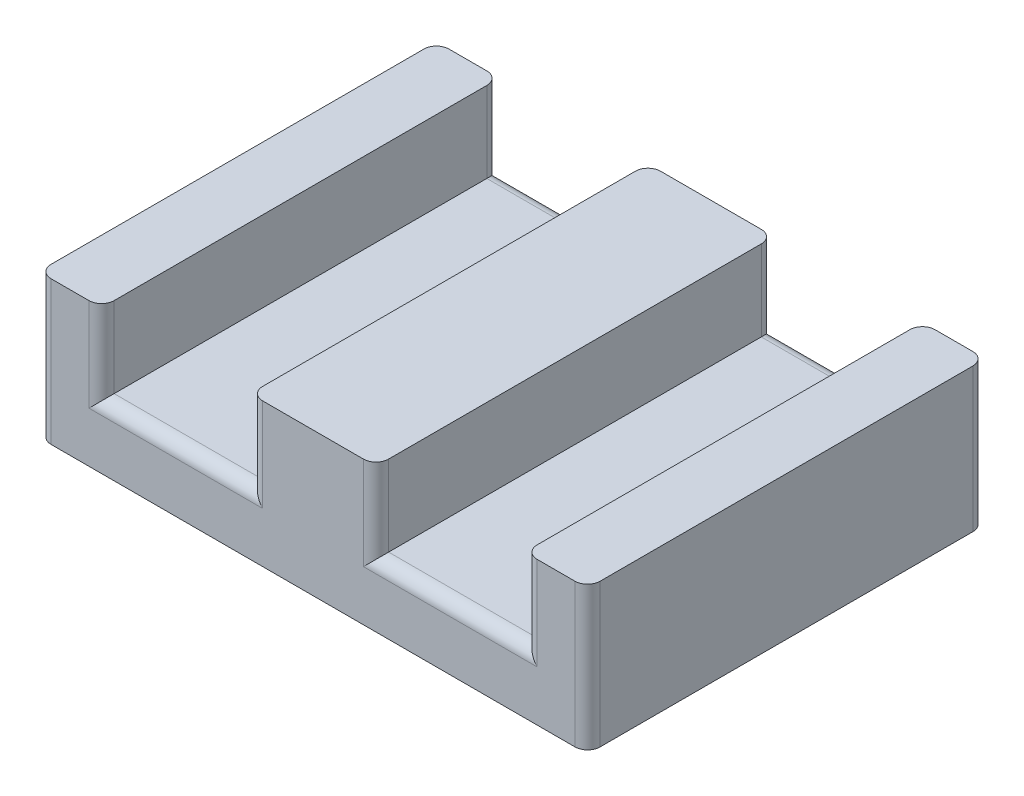
ISO-10303-21;
HEADER;
FILE_DESCRIPTION(('STEP AP214'),'2;1');
FILE_NAME('part.step','',(''),(''),'','','');
FILE_SCHEMA(('AUTOMOTIVE_DESIGN { 1 0 10303 214 1 1 1 1 }'));
ENDSEC;
DATA;
#1=APPLICATION_CONTEXT('core data for automotive mechanical design processes');
#2=APPLICATION_PROTOCOL_DEFINITION('international standard','automotive_design',2000,#1);
#3=PRODUCT_CONTEXT('',#1,'mechanical');
#4=PRODUCT('Part','Part','',(#3));
#5=PRODUCT_RELATED_PRODUCT_CATEGORY('part','',(#4));
#6=PRODUCT_DEFINITION_FORMATION('','',#4);
#7=PRODUCT_DEFINITION_CONTEXT('part definition',#1,'design');
#8=PRODUCT_DEFINITION('design','',#6,#7);
#9=PRODUCT_DEFINITION_SHAPE('','',#8);
#10=(LENGTH_UNIT() NAMED_UNIT(*) SI_UNIT(.MILLI.,.METRE.));
#11=(NAMED_UNIT(*) PLANE_ANGLE_UNIT() SI_UNIT($,.RADIAN.));
#12=(NAMED_UNIT(*) SI_UNIT($,.STERADIAN.) SOLID_ANGLE_UNIT());
#13=UNCERTAINTY_MEASURE_WITH_UNIT(LENGTH_MEASURE(1.E-05),#10,'distance_accuracy_value','');
#14=(GEOMETRIC_REPRESENTATION_CONTEXT(3) GLOBAL_UNCERTAINTY_ASSIGNED_CONTEXT((#13)) GLOBAL_UNIT_ASSIGNED_CONTEXT((#10,
#11,#12)) REPRESENTATION_CONTEXT('',''));
#15=CARTESIAN_POINT('',(0.,0.,0.));
#16=DIRECTION('',(0.,0.,1.));
#17=DIRECTION('',(1.,0.,0.));
#18=AXIS2_PLACEMENT_3D('',#15,#16,#17);
#19=CARTESIAN_POINT('',(-8.4,-0.411609977645424,-7.9));
#20=DIRECTION('',(0.,1.,0.));
#21=DIRECTION('',(-1.,0.,0.));
#22=AXIS2_PLACEMENT_3D('',#19,#20,#21);
#23=PLANE('',#22);
#24=DIRECTION('',(0.,0.,1.));
#25=VECTOR('',#24,1.);
#26=CARTESIAN_POINT('',(-2.5,-0.411609977645422,-7.9));
#27=LINE('',#26,#25);
#28=CARTESIAN_POINT('',(-2.5,-0.411609977645422,-7.4));
#29=VERTEX_POINT('',#28);
#30=CARTESIAN_POINT('',(-2.5,-0.411609977645422,7.4));
#31=VERTEX_POINT('',#30);
#32=EDGE_CURVE('E254',#29,#31,#27,.T.);
#33=ORIENTED_EDGE('',*,*,#32,.F.);
#34=DIRECTION('',(-1.,0.,0.));
#35=VECTOR('',#34,1.);
#36=CARTESIAN_POINT('',(-8.4,-0.411609977645424,-7.4));
#37=LINE('',#36,#35);
#38=CARTESIAN_POINT('',(-8.4,-0.411609977645424,-7.4));
#39=VERTEX_POINT('',#38);
#40=EDGE_CURVE('E307',#29,#39,#37,.T.);
#41=ORIENTED_EDGE('',*,*,#40,.T.);
#42=DIRECTION('',(0.,0.,1.));
#43=VECTOR('',#42,1.);
#44=CARTESIAN_POINT('',(-8.4,-0.411609977645424,-7.9));
#45=LINE('',#44,#43);
#46=CARTESIAN_POINT('',(-8.4,-0.411609977645424,7.4));
#47=VERTEX_POINT('',#46);
#48=EDGE_CURVE('E248',#39,#47,#45,.T.);
#49=ORIENTED_EDGE('',*,*,#48,.T.);
#50=DIRECTION('',(-1.,0.,0.));
#51=VECTOR('',#50,1.);
#52=CARTESIAN_POINT('',(-8.4,-0.411609977645424,7.4));
#53=LINE('',#52,#51);
#54=EDGE_CURVE('E304',#47,#31,#53,.F.);
#55=ORIENTED_EDGE('',*,*,#54,.T.);
#56=EDGE_LOOP('',(#33,#41,#49,#55));
#57=FACE_BOUND('',#56,.T.);
#58=ADVANCED_FACE('F39',(#57),#23,.T.);
#59=CARTESIAN_POINT('',(-2.5,-0.411609977645422,-7.9));
#60=DIRECTION('',(-1.,0.,0.));
#61=DIRECTION('',(0.,-1.,0.));
#62=AXIS2_PLACEMENT_3D('',#59,#60,#61);
#63=PLANE('',#62);
#64=DIRECTION('',(0.,0.,1.));
#65=VECTOR('',#64,1.);
#66=CARTESIAN_POINT('',(-2.5,2.78839002235458,-7.9));
#67=LINE('',#66,#65);
#68=CARTESIAN_POINT('',(-2.5,2.78839002235458,-7.4));
#69=VERTEX_POINT('',#68);
#70=CARTESIAN_POINT('',(-2.5,2.78839002235458,7.4));
#71=VERTEX_POINT('',#70);
#72=EDGE_CURVE('E466',#69,#71,#67,.T.);
#73=ORIENTED_EDGE('',*,*,#72,.F.);
#74=DIRECTION('',(0.,-1.,0.));
#75=VECTOR('',#74,1.);
#76=CARTESIAN_POINT('',(-2.5,-0.411609977645422,-7.4));
#77=LINE('',#76,#75);
#78=EDGE_CURVE('E320',#69,#29,#77,.T.);
#79=ORIENTED_EDGE('',*,*,#78,.T.);
#80=ORIENTED_EDGE('',*,*,#32,.T.);
#81=DIRECTION('',(0.,-1.,0.));
#82=VECTOR('',#81,1.);
#83=CARTESIAN_POINT('',(-2.5,-0.411609977645422,7.4));
#84=LINE('',#83,#82);
#85=EDGE_CURVE('E317',#31,#71,#84,.F.);
#86=ORIENTED_EDGE('',*,*,#85,.T.);
#87=EDGE_LOOP('',(#73,#79,#80,#86));
#88=FACE_BOUND('',#87,.T.);
#89=ADVANCED_FACE('F524',(#88),#63,.T.);
#90=CARTESIAN_POINT('',(2.5,2.78839002235458,-7.9));
#91=DIRECTION('',(0.,1.,0.));
#92=DIRECTION('',(0.,0.,1.));
#93=AXIS2_PLACEMENT_3D('',#90,#91,#92);
#94=PLANE('',#93);
#95=DIRECTION('',(-1.,0.,0.));
#96=VECTOR('',#95,1.);
#97=CARTESIAN_POINT('',(2.5,2.78839002235458,-7.9));
#98=LINE('',#97,#96);
#99=CARTESIAN_POINT('',(2.,2.78839002235458,-7.9));
#100=VERTEX_POINT('',#99);
#101=CARTESIAN_POINT('',(-2.,2.78839002235458,-7.9));
#102=VERTEX_POINT('',#101);
#103=EDGE_CURVE('E252',#100,#102,#98,.T.);
#104=ORIENTED_EDGE('',*,*,#103,.T.);
#105=CARTESIAN_POINT('',(-2.,2.78839002235458,-7.4));
#106=DIRECTION('',(0.,1.,0.));
#107=DIRECTION('',(0.,0.,1.));
#108=AXIS2_PLACEMENT_3D('',#105,#106,#107);
#109=CIRCLE('',#108,0.5);
#110=EDGE_CURVE('E332',#102,#69,#109,.T.);
#111=ORIENTED_EDGE('',*,*,#110,.T.);
#112=ORIENTED_EDGE('',*,*,#72,.T.);
#113=CARTESIAN_POINT('',(-2.,2.78839002235458,7.4));
#114=DIRECTION('',(0.,1.,0.));
#115=DIRECTION('',(0.,0.,1.));
#116=AXIS2_PLACEMENT_3D('',#113,#114,#115);
#117=CIRCLE('',#116,0.5);
#118=CARTESIAN_POINT('',(-2.,2.78839002235458,7.9));
#119=VERTEX_POINT('',#118);
#120=EDGE_CURVE('E323',#71,#119,#117,.T.);
#121=ORIENTED_EDGE('',*,*,#120,.T.);
#122=DIRECTION('',(-1.,0.,0.));
#123=VECTOR('',#122,1.);
#124=CARTESIAN_POINT('',(2.5,2.78839002235458,7.9));
#125=LINE('',#124,#123);
#126=CARTESIAN_POINT('',(2.,2.78839002235458,7.9));
#127=VERTEX_POINT('',#126);
#128=EDGE_CURVE('E446',#127,#119,#125,.T.);
#129=ORIENTED_EDGE('',*,*,#128,.F.);
#130=CARTESIAN_POINT('',(2.,2.78839002235458,7.4));
#131=DIRECTION('',(0.,1.,0.));
#132=DIRECTION('',(0.,0.,1.));
#133=AXIS2_PLACEMENT_3D('',#130,#131,#132);
#134=CIRCLE('',#133,0.5);
#135=CARTESIAN_POINT('',(2.5,2.78839002235458,7.4));
#136=VERTEX_POINT('',#135);
#137=EDGE_CURVE('E326',#127,#136,#134,.T.);
#138=ORIENTED_EDGE('',*,*,#137,.T.);
#139=DIRECTION('',(0.,0.,1.));
#140=VECTOR('',#139,1.);
#141=CARTESIAN_POINT('',(2.5,2.78839002235458,-7.9));
#142=LINE('',#141,#140);
#143=CARTESIAN_POINT('',(2.5,2.78839002235458,-7.4));
#144=VERTEX_POINT('',#143);
#145=EDGE_CURVE('E470',#144,#136,#142,.T.);
#146=ORIENTED_EDGE('',*,*,#145,.F.);
#147=CARTESIAN_POINT('',(2.,2.78839002235458,-7.4));
#148=DIRECTION('',(0.,1.,0.));
#149=DIRECTION('',(0.,0.,1.));
#150=AXIS2_PLACEMENT_3D('',#147,#148,#149);
#151=CIRCLE('',#150,0.5);
#152=EDGE_CURVE('E329',#144,#100,#151,.T.);
#153=ORIENTED_EDGE('',*,*,#152,.T.);
#154=EDGE_LOOP('',(#104,#111,#112,#121,#129,#138,#146,#153));
#155=FACE_BOUND('',#154,.T.);
#156=ADVANCED_FACE('F521',(#155),#94,.T.);
#157=CARTESIAN_POINT('',(2.5,-0.411609977645422,-7.9));
#158=DIRECTION('',(1.,0.,0.));
#159=DIRECTION('',(0.,1.,0.));
#160=AXIS2_PLACEMENT_3D('',#157,#158,#159);
#161=PLANE('',#160);
#162=DIRECTION('',(0.,0.,1.));
#163=VECTOR('',#162,1.);
#164=CARTESIAN_POINT('',(2.5,-0.411609977645422,-7.9));
#165=LINE('',#164,#163);
#166=CARTESIAN_POINT('',(2.5,-0.411609977645422,-7.4));
#167=VERTEX_POINT('',#166);
#168=CARTESIAN_POINT('',(2.5,-0.411609977645422,7.4));
#169=VERTEX_POINT('',#168);
#170=EDGE_CURVE('E474',#167,#169,#165,.T.);
#171=ORIENTED_EDGE('',*,*,#170,.F.);
#172=DIRECTION('',(0.,1.,0.));
#173=VECTOR('',#172,1.);
#174=CARTESIAN_POINT('',(2.5,2.78839002235458,-7.4));
#175=LINE('',#174,#173);
#176=EDGE_CURVE('E338',#167,#144,#175,.T.);
#177=ORIENTED_EDGE('',*,*,#176,.T.);
#178=ORIENTED_EDGE('',*,*,#145,.T.);
#179=DIRECTION('',(0.,1.,0.));
#180=VECTOR('',#179,1.);
#181=CARTESIAN_POINT('',(2.5,-0.411609977645422,7.4));
#182=LINE('',#181,#180);
#183=EDGE_CURVE('E335',#136,#169,#182,.F.);
#184=ORIENTED_EDGE('',*,*,#183,.T.);
#185=EDGE_LOOP('',(#171,#177,#178,#184));
#186=FACE_BOUND('',#185,.T.);
#187=ADVANCED_FACE('F559',(#186),#161,.T.);
#188=CARTESIAN_POINT('',(8.4,-0.411609977645422,-7.9));
#189=DIRECTION('',(0.,1.,0.));
#190=DIRECTION('',(-1.,0.,0.));
#191=AXIS2_PLACEMENT_3D('',#188,#189,#190);
#192=PLANE('',#191);
#193=DIRECTION('',(0.,0.,1.));
#194=VECTOR('',#193,1.);
#195=CARTESIAN_POINT('',(8.4,-0.411609977645422,-7.9));
#196=LINE('',#195,#194);
#197=CARTESIAN_POINT('',(8.4,-0.411609977645422,-7.4));
#198=VERTEX_POINT('',#197);
#199=CARTESIAN_POINT('',(8.4,-0.411609977645422,7.4));
#200=VERTEX_POINT('',#199);
#201=EDGE_CURVE('E478',#198,#200,#196,.T.);
#202=ORIENTED_EDGE('',*,*,#201,.F.);
#203=DIRECTION('',(-1.,0.,0.));
#204=VECTOR('',#203,1.);
#205=CARTESIAN_POINT('',(2.5,-0.411609977645422,-7.4));
#206=LINE('',#205,#204);
#207=EDGE_CURVE('E313',#198,#167,#206,.T.);
#208=ORIENTED_EDGE('',*,*,#207,.T.);
#209=ORIENTED_EDGE('',*,*,#170,.T.);
#210=DIRECTION('',(-1.,0.,0.));
#211=VECTOR('',#210,1.);
#212=CARTESIAN_POINT('',(8.4,-0.411609977645422,7.4));
#213=LINE('',#212,#211);
#214=EDGE_CURVE('E310',#169,#200,#213,.F.);
#215=ORIENTED_EDGE('',*,*,#214,.T.);
#216=EDGE_LOOP('',(#202,#208,#209,#215));
#217=FACE_BOUND('',#216,.T.);
#218=ADVANCED_FACE('F538',(#217),#192,.T.);
#219=CARTESIAN_POINT('',(8.4,2.78839002235458,-7.9));
#220=DIRECTION('',(-1.,0.,0.));
#221=DIRECTION('',(0.,-1.,0.));
#222=AXIS2_PLACEMENT_3D('',#219,#220,#221);
#223=PLANE('',#222);
#224=DIRECTION('',(0.,0.,1.));
#225=VECTOR('',#224,1.);
#226=CARTESIAN_POINT('',(8.4,2.78839002235458,-7.9));
#227=LINE('',#226,#225);
#228=CARTESIAN_POINT('',(8.4,2.78839002235458,-7.4));
#229=VERTEX_POINT('',#228);
#230=CARTESIAN_POINT('',(8.4,2.78839002235458,7.4));
#231=VERTEX_POINT('',#230);
#232=EDGE_CURVE('E482',#229,#231,#227,.T.);
#233=ORIENTED_EDGE('',*,*,#232,.F.);
#234=DIRECTION('',(0.,-1.,0.));
#235=VECTOR('',#234,1.);
#236=CARTESIAN_POINT('',(8.4,-0.411609977645422,-7.4));
#237=LINE('',#236,#235);
#238=EDGE_CURVE('E344',#229,#198,#237,.T.);
#239=ORIENTED_EDGE('',*,*,#238,.T.);
#240=ORIENTED_EDGE('',*,*,#201,.T.);
#241=DIRECTION('',(0.,-1.,0.));
#242=VECTOR('',#241,1.);
#243=CARTESIAN_POINT('',(8.4,2.78839002235458,7.4));
#244=LINE('',#243,#242);
#245=EDGE_CURVE('E341',#200,#231,#244,.F.);
#246=ORIENTED_EDGE('',*,*,#245,.T.);
#247=EDGE_LOOP('',(#233,#239,#240,#246));
#248=FACE_BOUND('',#247,.T.);
#249=ADVANCED_FACE('F543',(#248),#223,.T.);
#250=CARTESIAN_POINT('',(10.9,2.78839002235458,-7.9));
#251=DIRECTION('',(0.,1.,0.));
#252=DIRECTION('',(-1.,0.,0.));
#253=AXIS2_PLACEMENT_3D('',#250,#251,#252);
#254=PLANE('',#253);
#255=DIRECTION('',(-1.,0.,0.));
#256=VECTOR('',#255,1.);
#257=CARTESIAN_POINT('',(10.9,2.78839002235458,-7.9));
#258=LINE('',#257,#256);
#259=CARTESIAN_POINT('',(10.4,2.78839002235458,-7.9));
#260=VERTEX_POINT('',#259);
#261=CARTESIAN_POINT('',(8.9,2.78839002235458,-7.9));
#262=VERTEX_POINT('',#261);
#263=EDGE_CURVE('E456',#260,#262,#258,.T.);
#264=ORIENTED_EDGE('',*,*,#263,.T.);
#265=CARTESIAN_POINT('',(8.9,2.78839002235458,-7.4));
#266=DIRECTION('',(0.,1.,0.));
#267=DIRECTION('',(-1.,0.,0.));
#268=AXIS2_PLACEMENT_3D('',#265,#266,#267);
#269=CIRCLE('',#268,0.5);
#270=EDGE_CURVE('E356',#262,#229,#269,.T.);
#271=ORIENTED_EDGE('',*,*,#270,.T.);
#272=ORIENTED_EDGE('',*,*,#232,.T.);
#273=CARTESIAN_POINT('',(8.9,2.78839002235458,7.4));
#274=DIRECTION('',(0.,1.,0.));
#275=DIRECTION('',(-1.,0.,0.));
#276=AXIS2_PLACEMENT_3D('',#273,#274,#275);
#277=CIRCLE('',#276,0.5);
#278=CARTESIAN_POINT('',(8.9,2.78839002235458,7.9));
#279=VERTEX_POINT('',#278);
#280=EDGE_CURVE('E347',#231,#279,#277,.T.);
#281=ORIENTED_EDGE('',*,*,#280,.T.);
#282=DIRECTION('',(-1.,0.,0.));
#283=VECTOR('',#282,1.);
#284=CARTESIAN_POINT('',(10.9,2.78839002235458,7.9));
#285=LINE('',#284,#283);
#286=CARTESIAN_POINT('',(10.4,2.78839002235458,7.9));
#287=VERTEX_POINT('',#286);
#288=EDGE_CURVE('E440',#287,#279,#285,.T.);
#289=ORIENTED_EDGE('',*,*,#288,.F.);
#290=CARTESIAN_POINT('',(10.4,2.78839002235458,7.4));
#291=DIRECTION('',(0.,1.,0.));
#292=DIRECTION('',(-1.,0.,0.));
#293=AXIS2_PLACEMENT_3D('',#290,#291,#292);
#294=CIRCLE('',#293,0.5);
#295=CARTESIAN_POINT('',(10.9,2.78839002235458,7.4));
#296=VERTEX_POINT('',#295);
#297=EDGE_CURVE('E350',#287,#296,#294,.T.);
#298=ORIENTED_EDGE('',*,*,#297,.T.);
#299=DIRECTION('',(0.,0.,1.));
#300=VECTOR('',#299,1.);
#301=CARTESIAN_POINT('',(10.9,2.78839002235458,-7.9));
#302=LINE('',#301,#300);
#303=CARTESIAN_POINT('',(10.9,2.78839002235458,-7.4));
#304=VERTEX_POINT('',#303);
#305=EDGE_CURVE('E239',#304,#296,#302,.T.);
#306=ORIENTED_EDGE('',*,*,#305,.F.);
#307=CARTESIAN_POINT('',(10.4,2.78839002235458,-7.4));
#308=DIRECTION('',(0.,1.,0.));
#309=DIRECTION('',(-1.,0.,0.));
#310=AXIS2_PLACEMENT_3D('',#307,#308,#309);
#311=CIRCLE('',#310,0.5);
#312=EDGE_CURVE('E353',#304,#260,#311,.T.);
#313=ORIENTED_EDGE('',*,*,#312,.T.);
#314=EDGE_LOOP('',(#264,#271,#272,#281,#289,#298,#306,#313));
#315=FACE_BOUND('',#314,.T.);
#316=ADVANCED_FACE('F547',(#315),#254,.T.);
#317=CARTESIAN_POINT('',(10.9,-2.91160997764542,-7.9));
#318=DIRECTION('',(1.,0.,0.));
#319=DIRECTION('',(0.,0.,-1.));
#320=AXIS2_PLACEMENT_3D('',#317,#318,#319);
#321=PLANE('',#320);
#322=DIRECTION('',(0.,0.,1.));
#323=VECTOR('',#322,1.);
#324=CARTESIAN_POINT('',(10.9,-2.91160997764542,-7.9));
#325=LINE('',#324,#323);
#326=CARTESIAN_POINT('',(10.9,-2.91160997764542,-7.4));
#327=VERTEX_POINT('',#326);
#328=CARTESIAN_POINT('',(10.9,-2.91160997764542,7.4));
#329=VERTEX_POINT('',#328);
#330=EDGE_CURVE('E234',#327,#329,#325,.T.);
#331=ORIENTED_EDGE('',*,*,#330,.F.);
#332=DIRECTION('',(0.,1.,0.));
#333=VECTOR('',#332,1.);
#334=CARTESIAN_POINT('',(10.9,2.78839002235458,-7.4));
#335=LINE('',#334,#333);
#336=EDGE_CURVE('E362',#327,#304,#335,.T.);
#337=ORIENTED_EDGE('',*,*,#336,.T.);
#338=ORIENTED_EDGE('',*,*,#305,.T.);
#339=DIRECTION('',(0.,1.,0.));
#340=VECTOR('',#339,1.);
#341=CARTESIAN_POINT('',(10.9,-2.91160997764542,7.4));
#342=LINE('',#341,#340);
#343=EDGE_CURVE('E359',#296,#329,#342,.F.);
#344=ORIENTED_EDGE('',*,*,#343,.T.);
#345=EDGE_LOOP('',(#331,#337,#338,#344));
#346=FACE_BOUND('',#345,.T.);
#347=ADVANCED_FACE('F491',(#346),#321,.T.);
#348=CARTESIAN_POINT('',(-10.9,-2.91160997764542,-7.9));
#349=DIRECTION('',(0.,-1.,0.));
#350=DIRECTION('',(0.,0.,-1.));
#351=AXIS2_PLACEMENT_3D('',#348,#349,#350);
#352=PLANE('',#351);
#353=DIRECTION('',(0.,0.,1.));
#354=VECTOR('',#353,1.);
#355=CARTESIAN_POINT('',(-10.9,-2.91160997764542,-7.9));
#356=LINE('',#355,#354);
#357=CARTESIAN_POINT('',(-10.9,-2.91160997764542,-7.4));
#358=VERTEX_POINT('',#357);
#359=CARTESIAN_POINT('',(-10.9,-2.91160997764542,7.4));
#360=VERTEX_POINT('',#359);
#361=EDGE_CURVE('E223',#358,#360,#356,.T.);
#362=ORIENTED_EDGE('',*,*,#361,.F.);
#363=CARTESIAN_POINT('',(-10.4,-2.91160997764542,-7.4));
#364=DIRECTION('',(0.,-1.,0.));
#365=DIRECTION('',(0.,0.,-1.));
#366=AXIS2_PLACEMENT_3D('',#363,#364,#365);
#367=CIRCLE('',#366,0.5);
#368=CARTESIAN_POINT('',(-10.4,-2.91160997764542,-7.9));
#369=VERTEX_POINT('',#368);
#370=EDGE_CURVE('E205',#358,#369,#367,.T.);
#371=ORIENTED_EDGE('',*,*,#370,.T.);
#372=DIRECTION('',(1.,0.,0.));
#373=VECTOR('',#372,1.);
#374=CARTESIAN_POINT('',(-10.9,-2.91160997764542,-7.9));
#375=LINE('',#374,#373);
#376=CARTESIAN_POINT('',(10.4,-2.91160997764542,-7.9));
#377=VERTEX_POINT('',#376);
#378=EDGE_CURVE('E453',#369,#377,#375,.T.);
#379=ORIENTED_EDGE('',*,*,#378,.T.);
#380=CARTESIAN_POINT('',(10.4,-2.91160997764542,-7.4));
#381=DIRECTION('',(0.,-1.,0.));
#382=DIRECTION('',(0.,0.,-1.));
#383=AXIS2_PLACEMENT_3D('',#380,#381,#382);
#384=CIRCLE('',#383,0.5);
#385=EDGE_CURVE('E217',#377,#327,#384,.T.);
#386=ORIENTED_EDGE('',*,*,#385,.T.);
#387=ORIENTED_EDGE('',*,*,#330,.T.);
#388=CARTESIAN_POINT('',(10.4,-2.91160997764542,7.4));
#389=DIRECTION('',(0.,-1.,0.));
#390=DIRECTION('',(0.,0.,-1.));
#391=AXIS2_PLACEMENT_3D('',#388,#389,#390);
#392=CIRCLE('',#391,0.5);
#393=CARTESIAN_POINT('',(10.4,-2.91160997764542,7.9));
#394=VERTEX_POINT('',#393);
#395=EDGE_CURVE('E258',#329,#394,#392,.T.);
#396=ORIENTED_EDGE('',*,*,#395,.T.);
#397=DIRECTION('',(1.,0.,0.));
#398=VECTOR('',#397,1.);
#399=CARTESIAN_POINT('',(-10.9,-2.91160997764542,7.9));
#400=LINE('',#399,#398);
#401=CARTESIAN_POINT('',(-10.4,-2.91160997764542,7.9));
#402=VERTEX_POINT('',#401);
#403=EDGE_CURVE('E437',#402,#394,#400,.T.);
#404=ORIENTED_EDGE('',*,*,#403,.F.);
#405=CARTESIAN_POINT('',(-10.4,-2.91160997764542,7.4));
#406=DIRECTION('',(0.,-1.,0.));
#407=DIRECTION('',(0.,0.,-1.));
#408=AXIS2_PLACEMENT_3D('',#405,#406,#407);
#409=CIRCLE('',#408,0.5);
#410=EDGE_CURVE('E228',#402,#360,#409,.T.);
#411=ORIENTED_EDGE('',*,*,#410,.T.);
#412=EDGE_LOOP('',(#362,#371,#379,#386,#387,#396,#404,#411));
#413=FACE_BOUND('',#412,.T.);
#414=ADVANCED_FACE('F231',(#413),#352,.T.);
#415=CARTESIAN_POINT('',(-10.9,-2.91160997764542,-7.9));
#416=DIRECTION('',(-1.,0.,0.));
#417=DIRECTION('',(0.,0.,1.));
#418=AXIS2_PLACEMENT_3D('',#415,#416,#417);
#419=PLANE('',#418);
#420=DIRECTION('',(0.,0.,1.));
#421=VECTOR('',#420,1.);
#422=CARTESIAN_POINT('',(-10.9,2.78839002235458,-7.9));
#423=LINE('',#422,#421);
#424=CARTESIAN_POINT('',(-10.9,2.78839002235458,-7.4));
#425=VERTEX_POINT('',#424);
#426=CARTESIAN_POINT('',(-10.9,2.78839002235458,7.4));
#427=VERTEX_POINT('',#426);
#428=EDGE_CURVE('E226',#425,#427,#423,.T.);
#429=ORIENTED_EDGE('',*,*,#428,.F.);
#430=DIRECTION('',(0.,-1.,0.));
#431=VECTOR('',#430,1.);
#432=CARTESIAN_POINT('',(-10.9,-2.91160997764542,-7.4));
#433=LINE('',#432,#431);
#434=EDGE_CURVE('E209',#425,#358,#433,.T.);
#435=ORIENTED_EDGE('',*,*,#434,.T.);
#436=ORIENTED_EDGE('',*,*,#361,.T.);
#437=DIRECTION('',(0.,-1.,0.));
#438=VECTOR('',#437,1.);
#439=CARTESIAN_POINT('',(-10.9,-2.91160997764542,7.4));
#440=LINE('',#439,#438);
#441=EDGE_CURVE('E229',#360,#427,#440,.F.);
#442=ORIENTED_EDGE('',*,*,#441,.T.);
#443=EDGE_LOOP('',(#429,#435,#436,#442));
#444=FACE_BOUND('',#443,.T.);
#445=ADVANCED_FACE('F222',(#444),#419,.T.);
#446=CARTESIAN_POINT('',(-10.9,2.78839002235458,-7.9));
#447=DIRECTION('',(0.,1.,0.));
#448=DIRECTION('',(-1.,0.,0.));
#449=AXIS2_PLACEMENT_3D('',#446,#447,#448);
#450=PLANE('',#449);
#451=DIRECTION('',(-1.,0.,0.));
#452=VECTOR('',#451,1.);
#453=CARTESIAN_POINT('',(-10.9,2.78839002235458,-7.9));
#454=LINE('',#453,#452);
#455=CARTESIAN_POINT('',(-8.9,2.78839002235458,-7.9));
#456=VERTEX_POINT('',#455);
#457=CARTESIAN_POINT('',(-10.4,2.78839002235458,-7.9));
#458=VERTEX_POINT('',#457);
#459=EDGE_CURVE('E450',#456,#458,#454,.T.);
#460=ORIENTED_EDGE('',*,*,#459,.T.);
#461=CARTESIAN_POINT('',(-10.4,2.78839002235458,-7.4));
#462=DIRECTION('',(0.,1.,0.));
#463=DIRECTION('',(-1.,0.,0.));
#464=AXIS2_PLACEMENT_3D('',#461,#462,#463);
#465=CIRCLE('',#464,0.5);
#466=EDGE_CURVE('E294',#458,#425,#465,.T.);
#467=ORIENTED_EDGE('',*,*,#466,.T.);
#468=ORIENTED_EDGE('',*,*,#428,.T.);
#469=CARTESIAN_POINT('',(-10.4,2.78839002235458,7.4));
#470=DIRECTION('',(0.,1.,0.));
#471=DIRECTION('',(-1.,0.,0.));
#472=AXIS2_PLACEMENT_3D('',#469,#470,#471);
#473=CIRCLE('',#472,0.5);
#474=CARTESIAN_POINT('',(-10.4,2.78839002235458,7.9));
#475=VERTEX_POINT('',#474);
#476=EDGE_CURVE('E285',#427,#475,#473,.T.);
#477=ORIENTED_EDGE('',*,*,#476,.T.);
#478=DIRECTION('',(-1.,0.,0.));
#479=VECTOR('',#478,1.);
#480=CARTESIAN_POINT('',(-10.9,2.78839002235458,7.9));
#481=LINE('',#480,#479);
#482=CARTESIAN_POINT('',(-8.9,2.78839002235458,7.9));
#483=VERTEX_POINT('',#482);
#484=EDGE_CURVE('E396',#483,#475,#481,.T.);
#485=ORIENTED_EDGE('',*,*,#484,.F.);
#486=CARTESIAN_POINT('',(-8.9,2.78839002235458,7.4));
#487=DIRECTION('',(0.,1.,0.));
#488=DIRECTION('',(-1.,0.,0.));
#489=AXIS2_PLACEMENT_3D('',#486,#487,#488);
#490=CIRCLE('',#489,0.5);
#491=CARTESIAN_POINT('',(-8.4,2.78839002235458,7.4));
#492=VERTEX_POINT('',#491);
#493=EDGE_CURVE('E288',#483,#492,#490,.T.);
#494=ORIENTED_EDGE('',*,*,#493,.T.);
#495=DIRECTION('',(0.,0.,1.));
#496=VECTOR('',#495,1.);
#497=CARTESIAN_POINT('',(-8.4,2.78839002235458,-7.9));
#498=LINE('',#497,#496);
#499=CARTESIAN_POINT('',(-8.4,2.78839002235458,-7.4));
#500=VERTEX_POINT('',#499);
#501=EDGE_CURVE('E241',#500,#492,#498,.T.);
#502=ORIENTED_EDGE('',*,*,#501,.F.);
#503=CARTESIAN_POINT('',(-8.9,2.78839002235458,-7.4));
#504=DIRECTION('',(0.,1.,0.));
#505=DIRECTION('',(-1.,0.,0.));
#506=AXIS2_PLACEMENT_3D('',#503,#504,#505);
#507=CIRCLE('',#506,0.5);
#508=EDGE_CURVE('E291',#500,#456,#507,.T.);
#509=ORIENTED_EDGE('',*,*,#508,.T.);
#510=EDGE_LOOP('',(#460,#467,#468,#477,#485,#494,#502,#509));
#511=FACE_BOUND('',#510,.T.);
#512=ADVANCED_FACE('F433',(#511),#450,.T.);
#513=CARTESIAN_POINT('',(-8.4,2.78839002235458,-7.9));
#514=DIRECTION('',(1.,0.,0.));
#515=DIRECTION('',(0.,1.,0.));
#516=AXIS2_PLACEMENT_3D('',#513,#514,#515);
#517=PLANE('',#516);
#518=ORIENTED_EDGE('',*,*,#48,.F.);
#519=DIRECTION('',(0.,1.,0.));
#520=VECTOR('',#519,1.);
#521=CARTESIAN_POINT('',(-8.4,2.78839002235458,-7.4));
#522=LINE('',#521,#520);
#523=EDGE_CURVE('E300',#39,#500,#522,.T.);
#524=ORIENTED_EDGE('',*,*,#523,.T.);
#525=ORIENTED_EDGE('',*,*,#501,.T.);
#526=DIRECTION('',(0.,1.,0.));
#527=VECTOR('',#526,1.);
#528=CARTESIAN_POINT('',(-8.4,2.78839002235458,7.4));
#529=LINE('',#528,#527);
#530=EDGE_CURVE('E297',#492,#47,#529,.F.);
#531=ORIENTED_EDGE('',*,*,#530,.T.);
#532=EDGE_LOOP('',(#518,#524,#525,#531));
#533=FACE_BOUND('',#532,.T.);
#534=ADVANCED_FACE('F588',(#533),#517,.T.);
#535=CARTESIAN_POINT('',(0.,0.,-7.9));
#536=DIRECTION('',(0.,0.,1.));
#537=DIRECTION('',(1.,0.,0.));
#538=AXIS2_PLACEMENT_3D('',#535,#536,#537);
#539=PLANE('',#538);
#540=ORIENTED_EDGE('',*,*,#378,.F.);
#541=DIRECTION('',(0.,-1.,0.));
#542=VECTOR('',#541,1.);
#543=CARTESIAN_POINT('',(-10.4,2.78839002235458,-7.9));
#544=LINE('',#543,#542);
#545=EDGE_CURVE('E210',#369,#458,#544,.F.);
#546=ORIENTED_EDGE('',*,*,#545,.T.);
#547=ORIENTED_EDGE('',*,*,#459,.F.);
#548=DIRECTION('',(0.,1.,0.));
#549=VECTOR('',#548,1.);
#550=CARTESIAN_POINT('',(-8.9,-0.411609977645425,-7.9));
#551=LINE('',#550,#549);
#552=CARTESIAN_POINT('',(-8.9,-0.911609977645424,-7.9));
#553=VERTEX_POINT('',#552);
#554=EDGE_CURVE('E280',#456,#553,#551,.F.);
#555=ORIENTED_EDGE('',*,*,#554,.T.);
#556=DIRECTION('',(-1.,0.,0.));
#557=VECTOR('',#556,1.);
#558=CARTESIAN_POINT('',(-2.5,-0.911609977645422,-7.9));
#559=LINE('',#558,#557);
#560=CARTESIAN_POINT('',(-2.,-0.911609977645422,-7.9));
#561=VERTEX_POINT('',#560);
#562=EDGE_CURVE('E277',#553,#561,#559,.F.);
#563=ORIENTED_EDGE('',*,*,#562,.T.);
#564=DIRECTION('',(0.,-1.,0.));
#565=VECTOR('',#564,1.);
#566=CARTESIAN_POINT('',(-2.,2.78839002235458,-7.9));
#567=LINE('',#566,#565);
#568=EDGE_CURVE('E274',#561,#102,#567,.F.);
#569=ORIENTED_EDGE('',*,*,#568,.T.);
#570=ORIENTED_EDGE('',*,*,#103,.F.);
#571=DIRECTION('',(0.,1.,0.));
#572=VECTOR('',#571,1.);
#573=CARTESIAN_POINT('',(2.,-0.411609977645422,-7.9));
#574=LINE('',#573,#572);
#575=CARTESIAN_POINT('',(2.,-0.911609977645422,-7.9));
#576=VERTEX_POINT('',#575);
#577=EDGE_CURVE('E271',#100,#576,#574,.F.);
#578=ORIENTED_EDGE('',*,*,#577,.T.);
#579=DIRECTION('',(-1.,0.,0.));
#580=VECTOR('',#579,1.);
#581=CARTESIAN_POINT('',(8.4,-0.911609977645422,-7.9));
#582=LINE('',#581,#580);
#583=CARTESIAN_POINT('',(8.9,-0.911609977645421,-7.9));
#584=VERTEX_POINT('',#583);
#585=EDGE_CURVE('E268',#576,#584,#582,.F.);
#586=ORIENTED_EDGE('',*,*,#585,.T.);
#587=DIRECTION('',(0.,-1.,0.));
#588=VECTOR('',#587,1.);
#589=CARTESIAN_POINT('',(8.9,2.78839002235458,-7.9));
#590=LINE('',#589,#588);
#591=EDGE_CURVE('E265',#584,#262,#590,.F.);
#592=ORIENTED_EDGE('',*,*,#591,.T.);
#593=ORIENTED_EDGE('',*,*,#263,.F.);
#594=DIRECTION('',(0.,1.,0.));
#595=VECTOR('',#594,1.);
#596=CARTESIAN_POINT('',(10.4,-2.91160997764542,-7.9));
#597=LINE('',#596,#595);
#598=EDGE_CURVE('E216',#260,#377,#597,.F.);
#599=ORIENTED_EDGE('',*,*,#598,.T.);
#600=EDGE_LOOP('',(#540,#546,#547,#555,#563,#569,#570,#578,#586,#592,#593,#599));
#601=FACE_BOUND('',#600,.T.);
#602=ADVANCED_FACE('F503',(#601),#539,.F.);
#603=CARTESIAN_POINT('',(0.,0.,7.9));
#604=DIRECTION('',(0.,0.,1.));
#605=DIRECTION('',(1.,0.,0.));
#606=AXIS2_PLACEMENT_3D('',#603,#604,#605);
#607=PLANE('',#606);
#608=ORIENTED_EDGE('',*,*,#403,.T.);
#609=DIRECTION('',(0.,1.,0.));
#610=VECTOR('',#609,1.);
#611=CARTESIAN_POINT('',(10.4,0.,7.9));
#612=LINE('',#611,#610);
#613=EDGE_CURVE('E11',#394,#287,#612,.T.);
#614=ORIENTED_EDGE('',*,*,#613,.T.);
#615=ORIENTED_EDGE('',*,*,#288,.T.);
#616=DIRECTION('',(0.,-1.,0.));
#617=VECTOR('',#616,1.);
#618=CARTESIAN_POINT('',(8.9,0.,7.9));
#619=LINE('',#618,#617);
#620=CARTESIAN_POINT('',(8.9,-0.911609977645421,7.9));
#621=VERTEX_POINT('',#620);
#622=EDGE_CURVE('E49',#279,#621,#619,.T.);
#623=ORIENTED_EDGE('',*,*,#622,.T.);
#624=DIRECTION('',(-1.,0.,0.));
#625=VECTOR('',#624,1.);
#626=CARTESIAN_POINT('',(0.,-0.911609977645423,7.9));
#627=LINE('',#626,#625);
#628=CARTESIAN_POINT('',(2.,-0.911609977645422,7.9));
#629=VERTEX_POINT('',#628);
#630=EDGE_CURVE('E64',#621,#629,#627,.T.);
#631=ORIENTED_EDGE('',*,*,#630,.T.);
#632=DIRECTION('',(0.,1.,0.));
#633=VECTOR('',#632,1.);
#634=CARTESIAN_POINT('',(2.,0.,7.9));
#635=LINE('',#634,#633);
#636=EDGE_CURVE('E380',#629,#127,#635,.T.);
#637=ORIENTED_EDGE('',*,*,#636,.T.);
#638=ORIENTED_EDGE('',*,*,#128,.T.);
#639=DIRECTION('',(0.,-1.,0.));
#640=VECTOR('',#639,1.);
#641=CARTESIAN_POINT('',(-2.,0.,7.9));
#642=LINE('',#641,#640);
#643=CARTESIAN_POINT('',(-2.,-0.911609977645422,7.9));
#644=VERTEX_POINT('',#643);
#645=EDGE_CURVE('E376',#119,#644,#642,.T.);
#646=ORIENTED_EDGE('',*,*,#645,.T.);
#647=DIRECTION('',(-1.,0.,0.));
#648=VECTOR('',#647,1.);
#649=CARTESIAN_POINT('',(0.,-0.911609977645422,7.9));
#650=LINE('',#649,#648);
#651=CARTESIAN_POINT('',(-8.9,-0.911609977645424,7.9));
#652=VERTEX_POINT('',#651);
#653=EDGE_CURVE('E373',#644,#652,#650,.T.);
#654=ORIENTED_EDGE('',*,*,#653,.T.);
#655=DIRECTION('',(0.,1.,0.));
#656=VECTOR('',#655,1.);
#657=CARTESIAN_POINT('',(-8.9,0.,7.9));
#658=LINE('',#657,#656);
#659=EDGE_CURVE('E370',#652,#483,#658,.T.);
#660=ORIENTED_EDGE('',*,*,#659,.T.);
#661=ORIENTED_EDGE('',*,*,#484,.T.);
#662=DIRECTION('',(0.,-1.,0.));
#663=VECTOR('',#662,1.);
#664=CARTESIAN_POINT('',(-10.4,0.,7.9));
#665=LINE('',#664,#663);
#666=EDGE_CURVE('E366',#475,#402,#665,.T.);
#667=ORIENTED_EDGE('',*,*,#666,.T.);
#668=EDGE_LOOP('',(#608,#614,#615,#623,#631,#637,#638,#646,#654,#660,#661,#667));
#669=FACE_BOUND('',#668,.T.);
#670=ADVANCED_FACE('F429',(#669),#607,.T.);
#671=CARTESIAN_POINT('',(-10.4,-2.91160997764542,-7.4));
#672=DIRECTION('',(0.,1.,0.));
#673=DIRECTION('',(0.,0.,1.));
#674=AXIS2_PLACEMENT_3D('',#671,#672,#673);
#675=CYLINDRICAL_SURFACE('',#674,0.5);
#676=ORIENTED_EDGE('',*,*,#466,.F.);
#677=ORIENTED_EDGE('',*,*,#545,.F.);
#678=ORIENTED_EDGE('',*,*,#370,.F.);
#679=ORIENTED_EDGE('',*,*,#434,.F.);
#680=EDGE_LOOP('',(#676,#677,#678,#679));
#681=FACE_BOUND('',#680,.T.);
#682=ADVANCED_FACE('F208',(#681),#675,.T.);
#683=CARTESIAN_POINT('',(-2.,-0.411609977645422,-7.4));
#684=DIRECTION('',(0.,1.,0.));
#685=DIRECTION('',(-1.,0.,0.));
#686=AXIS2_PLACEMENT_3D('',#683,#684,#685);
#687=CYLINDRICAL_SURFACE('',#686,0.5);
#688=ORIENTED_EDGE('',*,*,#110,.F.);
#689=ORIENTED_EDGE('',*,*,#568,.F.);
#690=CARTESIAN_POINT('',(-2.,-0.911609977645422,-7.4));
#691=DIRECTION('',(0.707106781186547,0.707106781186548,0.));
#692=DIRECTION('',(0.707106781186548,-0.707106781186547,0.));
#693=AXIS2_PLACEMENT_3D('',#690,#691,#692);
#694=ELLIPSE('',#693,0.707106781186547,0.5);
#695=EDGE_CURVE('E391',#29,#561,#694,.F.);
#696=ORIENTED_EDGE('',*,*,#695,.F.);
#697=ORIENTED_EDGE('',*,*,#78,.F.);
#698=EDGE_LOOP('',(#688,#689,#696,#697));
#699=FACE_BOUND('',#698,.T.);
#700=ADVANCED_FACE('F517',(#699),#687,.T.);
#701=CARTESIAN_POINT('',(-8.4,-0.911609977645424,-7.4));
#702=DIRECTION('',(1.,0.,0.));
#703=DIRECTION('',(0.,1.,0.));
#704=AXIS2_PLACEMENT_3D('',#701,#702,#703);
#705=CYLINDRICAL_SURFACE('',#704,0.5);
#706=ORIENTED_EDGE('',*,*,#695,.T.);
#707=ORIENTED_EDGE('',*,*,#562,.F.);
#708=CARTESIAN_POINT('',(-8.9,-0.911609977645424,-7.4));
#709=DIRECTION('',(0.707106781186548,-0.707106781186547,0.));
#710=DIRECTION('',(-0.707106781186547,-0.707106781186548,0.));
#711=AXIS2_PLACEMENT_3D('',#708,#709,#710);
#712=ELLIPSE('',#711,0.707106781186547,0.5);
#713=EDGE_CURVE('E387',#39,#553,#712,.F.);
#714=ORIENTED_EDGE('',*,*,#713,.F.);
#715=ORIENTED_EDGE('',*,*,#40,.F.);
#716=EDGE_LOOP('',(#706,#707,#714,#715));
#717=FACE_BOUND('',#716,.T.);
#718=ADVANCED_FACE('F511',(#717),#705,.T.);
#719=CARTESIAN_POINT('',(-8.9,2.78839002235458,-7.4));
#720=DIRECTION('',(0.,-1.,0.));
#721=DIRECTION('',(1.,0.,0.));
#722=AXIS2_PLACEMENT_3D('',#719,#720,#721);
#723=CYLINDRICAL_SURFACE('',#722,0.5);
#724=ORIENTED_EDGE('',*,*,#713,.T.);
#725=ORIENTED_EDGE('',*,*,#554,.F.);
#726=ORIENTED_EDGE('',*,*,#508,.F.);
#727=ORIENTED_EDGE('',*,*,#523,.F.);
#728=EDGE_LOOP('',(#724,#725,#726,#727));
#729=FACE_BOUND('',#728,.T.);
#730=ADVANCED_FACE('F506',(#729),#723,.T.);
#731=CARTESIAN_POINT('',(8.9,2.78839002235458,-7.4));
#732=DIRECTION('',(0.,1.,0.));
#733=DIRECTION('',(-1.,0.,0.));
#734=AXIS2_PLACEMENT_3D('',#731,#732,#733);
#735=CYLINDRICAL_SURFACE('',#734,0.5);
#736=ORIENTED_EDGE('',*,*,#270,.F.);
#737=ORIENTED_EDGE('',*,*,#591,.F.);
#738=CARTESIAN_POINT('',(8.9,-0.911609977645422,-7.4));
#739=DIRECTION('',(0.707106781186548,0.707106781186547,0.));
#740=DIRECTION('',(0.707106781186547,-0.707106781186548,0.));
#741=AXIS2_PLACEMENT_3D('',#738,#739,#740);
#742=ELLIPSE('',#741,0.707106781186547,0.5);
#743=EDGE_CURVE('E392',#198,#584,#742,.F.);
#744=ORIENTED_EDGE('',*,*,#743,.F.);
#745=ORIENTED_EDGE('',*,*,#238,.F.);
#746=EDGE_LOOP('',(#736,#737,#744,#745));
#747=FACE_BOUND('',#746,.T.);
#748=ADVANCED_FACE('F550',(#747),#735,.T.);
#749=CARTESIAN_POINT('',(2.,-0.411609977645422,-7.4));
#750=DIRECTION('',(0.,-1.,0.));
#751=DIRECTION('',(1.,0.,0.));
#752=AXIS2_PLACEMENT_3D('',#749,#750,#751);
#753=CYLINDRICAL_SURFACE('',#752,0.5);
#754=ORIENTED_EDGE('',*,*,#152,.F.);
#755=ORIENTED_EDGE('',*,*,#176,.F.);
#756=CARTESIAN_POINT('',(2.,-0.911609977645422,-7.4));
#757=DIRECTION('',(0.707106781186547,-0.707106781186547,0.));
#758=DIRECTION('',(0.707106781186547,0.707106781186547,0.));
#759=AXIS2_PLACEMENT_3D('',#756,#757,#758);
#760=ELLIPSE('',#759,0.707106781186548,0.5);
#761=EDGE_CURVE('E397',#576,#167,#760,.T.);
#762=ORIENTED_EDGE('',*,*,#761,.F.);
#763=ORIENTED_EDGE('',*,*,#577,.F.);
#764=EDGE_LOOP('',(#754,#755,#762,#763));
#765=FACE_BOUND('',#764,.T.);
#766=ADVANCED_FACE('F564',(#765),#753,.T.);
#767=CARTESIAN_POINT('',(8.4,-0.911609977645422,-7.4));
#768=DIRECTION('',(1.,0.,0.));
#769=DIRECTION('',(0.,1.,0.));
#770=AXIS2_PLACEMENT_3D('',#767,#768,#769);
#771=CYLINDRICAL_SURFACE('',#770,0.5);
#772=ORIENTED_EDGE('',*,*,#743,.T.);
#773=ORIENTED_EDGE('',*,*,#585,.F.);
#774=ORIENTED_EDGE('',*,*,#761,.T.);
#775=ORIENTED_EDGE('',*,*,#207,.F.);
#776=EDGE_LOOP('',(#772,#773,#774,#775));
#777=FACE_BOUND('',#776,.T.);
#778=ADVANCED_FACE('F555',(#777),#771,.T.);
#779=CARTESIAN_POINT('',(10.4,-2.91160997764542,-7.4));
#780=DIRECTION('',(0.,-1.,0.));
#781=DIRECTION('',(0.,0.,-1.));
#782=AXIS2_PLACEMENT_3D('',#779,#780,#781);
#783=CYLINDRICAL_SURFACE('',#782,0.5);
#784=ORIENTED_EDGE('',*,*,#385,.F.);
#785=ORIENTED_EDGE('',*,*,#598,.F.);
#786=ORIENTED_EDGE('',*,*,#312,.F.);
#787=ORIENTED_EDGE('',*,*,#336,.F.);
#788=EDGE_LOOP('',(#784,#785,#786,#787));
#789=FACE_BOUND('',#788,.T.);
#790=ADVANCED_FACE('F569',(#789),#783,.T.);
#791=CARTESIAN_POINT('',(10.4,0.,7.4));
#792=DIRECTION('',(0.,1.,0.));
#793=DIRECTION('',(0.,0.,1.));
#794=AXIS2_PLACEMENT_3D('',#791,#792,#793);
#795=CYLINDRICAL_SURFACE('',#794,0.5);
#796=ORIENTED_EDGE('',*,*,#395,.F.);
#797=ORIENTED_EDGE('',*,*,#343,.F.);
#798=ORIENTED_EDGE('',*,*,#297,.F.);
#799=ORIENTED_EDGE('',*,*,#613,.F.);
#800=EDGE_LOOP('',(#796,#797,#798,#799));
#801=FACE_BOUND('',#800,.T.);
#802=ADVANCED_FACE('F496',(#801),#795,.T.);
#803=CARTESIAN_POINT('',(2.,0.,7.4));
#804=DIRECTION('',(0.,1.,0.));
#805=DIRECTION('',(-1.,0.,0.));
#806=AXIS2_PLACEMENT_3D('',#803,#804,#805);
#807=CYLINDRICAL_SURFACE('',#806,0.5);
#808=ORIENTED_EDGE('',*,*,#137,.F.);
#809=ORIENTED_EDGE('',*,*,#636,.F.);
#810=CARTESIAN_POINT('',(2.,-0.911609977645422,7.4));
#811=DIRECTION('',(-0.707106781186547,0.707106781186547,0.));
#812=DIRECTION('',(-0.707106781186547,-0.707106781186547,0.));
#813=AXIS2_PLACEMENT_3D('',#810,#811,#812);
#814=ELLIPSE('',#813,0.707106781186548,0.5);
#815=EDGE_CURVE('E400',#169,#629,#814,.F.);
#816=ORIENTED_EDGE('',*,*,#815,.F.);
#817=ORIENTED_EDGE('',*,*,#183,.F.);
#818=EDGE_LOOP('',(#808,#809,#816,#817));
#819=FACE_BOUND('',#818,.T.);
#820=ADVANCED_FACE('F531',(#819),#807,.T.);
#821=CARTESIAN_POINT('',(0.,-0.911609977645423,7.4));
#822=DIRECTION('',(-1.,0.,0.));
#823=DIRECTION('',(0.,-1.,0.));
#824=AXIS2_PLACEMENT_3D('',#821,#822,#823);
#825=CYLINDRICAL_SURFACE('',#824,0.5);
#826=ORIENTED_EDGE('',*,*,#815,.T.);
#827=ORIENTED_EDGE('',*,*,#630,.F.);
#828=CARTESIAN_POINT('',(8.9,-0.911609977645422,7.4));
#829=DIRECTION('',(-0.707106781186548,-0.707106781186547,0.));
#830=DIRECTION('',(0.707106781186547,-0.707106781186548,0.));
#831=AXIS2_PLACEMENT_3D('',#828,#829,#830);
#832=ELLIPSE('',#831,0.707106781186547,0.5);
#833=EDGE_CURVE('E57',#200,#621,#832,.F.);
#834=ORIENTED_EDGE('',*,*,#833,.F.);
#835=ORIENTED_EDGE('',*,*,#214,.F.);
#836=EDGE_LOOP('',(#826,#827,#834,#835));
#837=FACE_BOUND('',#836,.T.);
#838=ADVANCED_FACE('F535',(#837),#825,.T.);
#839=CARTESIAN_POINT('',(8.9,0.,7.4));
#840=DIRECTION('',(0.,-1.,0.));
#841=DIRECTION('',(1.,0.,0.));
#842=AXIS2_PLACEMENT_3D('',#839,#840,#841);
#843=CYLINDRICAL_SURFACE('',#842,0.5);
#844=ORIENTED_EDGE('',*,*,#280,.F.);
#845=ORIENTED_EDGE('',*,*,#245,.F.);
#846=ORIENTED_EDGE('',*,*,#833,.T.);
#847=ORIENTED_EDGE('',*,*,#622,.F.);
#848=EDGE_LOOP('',(#844,#845,#846,#847));
#849=FACE_BOUND('',#848,.T.);
#850=ADVANCED_FACE('F546',(#849),#843,.T.);
#851=CARTESIAN_POINT('',(-8.9,0.,7.4));
#852=DIRECTION('',(0.,1.,0.));
#853=DIRECTION('',(-1.,0.,0.));
#854=AXIS2_PLACEMENT_3D('',#851,#852,#853);
#855=CYLINDRICAL_SURFACE('',#854,0.5);
#856=ORIENTED_EDGE('',*,*,#493,.F.);
#857=ORIENTED_EDGE('',*,*,#659,.F.);
#858=CARTESIAN_POINT('',(-8.9,-0.911609977645424,7.4));
#859=DIRECTION('',(-0.707106781186548,0.707106781186547,0.));
#860=DIRECTION('',(-0.707106781186547,-0.707106781186548,0.));
#861=AXIS2_PLACEMENT_3D('',#858,#859,#860);
#862=ELLIPSE('',#861,0.707106781186547,0.5);
#863=EDGE_CURVE('E43',#47,#652,#862,.F.);
#864=ORIENTED_EDGE('',*,*,#863,.F.);
#865=ORIENTED_EDGE('',*,*,#530,.F.);
#866=EDGE_LOOP('',(#856,#857,#864,#865));
#867=FACE_BOUND('',#866,.T.);
#868=ADVANCED_FACE('F425',(#867),#855,.T.);
#869=CARTESIAN_POINT('',(0.,-0.911609977645422,7.4));
#870=DIRECTION('',(-1.,0.,0.));
#871=DIRECTION('',(0.,-1.,0.));
#872=AXIS2_PLACEMENT_3D('',#869,#870,#871);
#873=CYLINDRICAL_SURFACE('',#872,0.5);
#874=ORIENTED_EDGE('',*,*,#863,.T.);
#875=ORIENTED_EDGE('',*,*,#653,.F.);
#876=CARTESIAN_POINT('',(-2.,-0.911609977645422,7.4));
#877=DIRECTION('',(-0.707106781186547,-0.707106781186548,0.));
#878=DIRECTION('',(0.707106781186548,-0.707106781186547,0.));
#879=AXIS2_PLACEMENT_3D('',#876,#877,#878);
#880=ELLIPSE('',#879,0.707106781186547,0.5);
#881=EDGE_CURVE('E408',#31,#644,#880,.F.);
#882=ORIENTED_EDGE('',*,*,#881,.F.);
#883=ORIENTED_EDGE('',*,*,#54,.F.);
#884=EDGE_LOOP('',(#874,#875,#882,#883));
#885=FACE_BOUND('',#884,.T.);
#886=ADVANCED_FACE('F420',(#885),#873,.T.);
#887=CARTESIAN_POINT('',(-2.,0.,7.4));
#888=DIRECTION('',(0.,-1.,0.));
#889=DIRECTION('',(1.,0.,0.));
#890=AXIS2_PLACEMENT_3D('',#887,#888,#889);
#891=CYLINDRICAL_SURFACE('',#890,0.5);
#892=ORIENTED_EDGE('',*,*,#120,.F.);
#893=ORIENTED_EDGE('',*,*,#85,.F.);
#894=ORIENTED_EDGE('',*,*,#881,.T.);
#895=ORIENTED_EDGE('',*,*,#645,.F.);
#896=EDGE_LOOP('',(#892,#893,#894,#895));
#897=FACE_BOUND('',#896,.T.);
#898=ADVANCED_FACE('F526',(#897),#891,.T.);
#899=CARTESIAN_POINT('',(-10.4,0.,7.4));
#900=DIRECTION('',(0.,-1.,0.));
#901=DIRECTION('',(0.,0.,-1.));
#902=AXIS2_PLACEMENT_3D('',#899,#900,#901);
#903=CYLINDRICAL_SURFACE('',#902,0.5);
#904=ORIENTED_EDGE('',*,*,#476,.F.);
#905=ORIENTED_EDGE('',*,*,#441,.F.);
#906=ORIENTED_EDGE('',*,*,#410,.F.);
#907=ORIENTED_EDGE('',*,*,#666,.F.);
#908=EDGE_LOOP('',(#904,#905,#906,#907));
#909=FACE_BOUND('',#908,.T.);
#910=ADVANCED_FACE('F41',(#909),#903,.T.);
#911=CLOSED_SHELL('',(#58,#89,#156,#187,#218,#249,#316,#347,#414,#445,#512,#534,#602,#670,#682,
#700,#718,#730,#748,#766,#778,#790,#802,#820,#838,#850,#868,#886,#898,#910));
#912=MANIFOLD_SOLID_BREP('B2',#911);
#913=ADVANCED_BREP_SHAPE_REPRESENTATION('',(#18,#912),#14);
#914=SHAPE_DEFINITION_REPRESENTATION(#9,#913);
ENDSEC;
END-ISO-10303-21;
